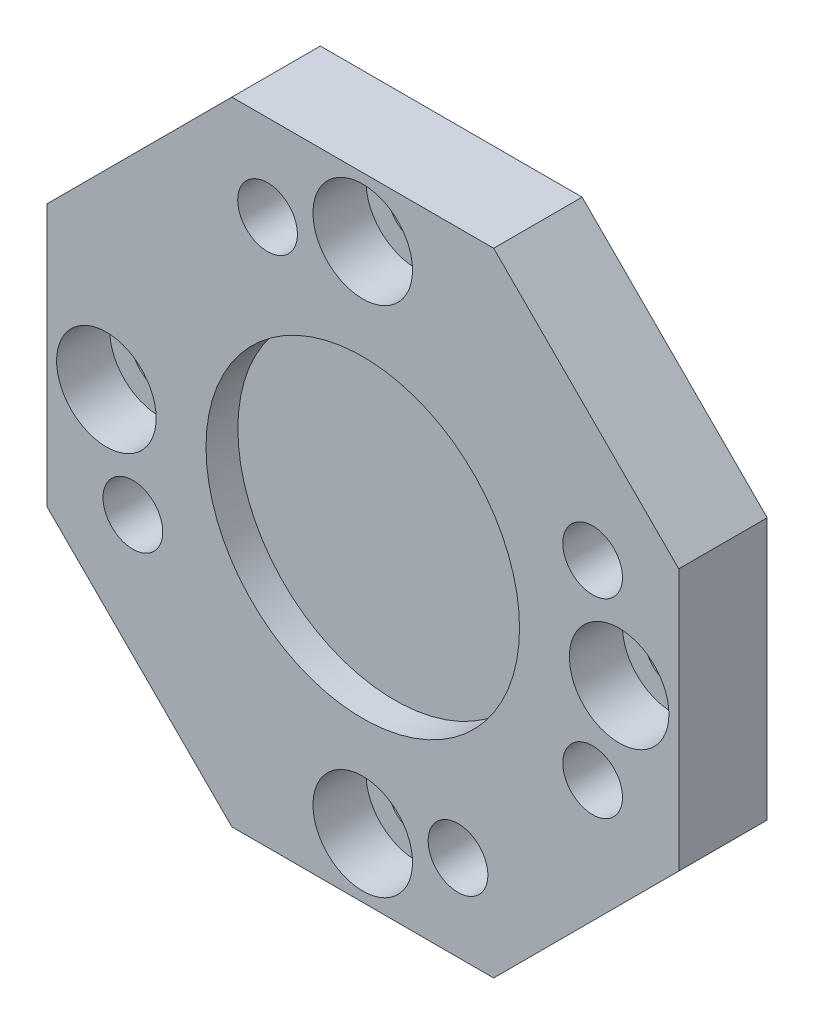
ISO-10303-21;
HEADER;
FILE_DESCRIPTION(('STEP AP214'),'2;1');
FILE_NAME('part.step','',(''),(''),'','','');
FILE_SCHEMA(('AUTOMOTIVE_DESIGN { 1 0 10303 214 1 1 1 1 }'));
ENDSEC;
DATA;
#1=APPLICATION_CONTEXT('core data for automotive mechanical design processes');
#2=APPLICATION_PROTOCOL_DEFINITION('international standard','automotive_design',2000,#1);
#3=PRODUCT_CONTEXT('',#1,'mechanical');
#4=PRODUCT('Part','Part','',(#3));
#5=PRODUCT_RELATED_PRODUCT_CATEGORY('part','',(#4));
#6=PRODUCT_DEFINITION_FORMATION('','',#4);
#7=PRODUCT_DEFINITION_CONTEXT('part definition',#1,'design');
#8=PRODUCT_DEFINITION('design','',#6,#7);
#9=PRODUCT_DEFINITION_SHAPE('','',#8);
#10=(LENGTH_UNIT() NAMED_UNIT(*) SI_UNIT(.MILLI.,.METRE.));
#11=(NAMED_UNIT(*) PLANE_ANGLE_UNIT() SI_UNIT($,.RADIAN.));
#12=(NAMED_UNIT(*) SI_UNIT($,.STERADIAN.) SOLID_ANGLE_UNIT());
#13=UNCERTAINTY_MEASURE_WITH_UNIT(LENGTH_MEASURE(1.E-05),#10,'distance_accuracy_value','');
#14=(GEOMETRIC_REPRESENTATION_CONTEXT(3) GLOBAL_UNCERTAINTY_ASSIGNED_CONTEXT((#13)) GLOBAL_UNIT_ASSIGNED_CONTEXT((#10,
#11,#12)) REPRESENTATION_CONTEXT('',''));
#15=CARTESIAN_POINT('',(0.,0.,0.));
#16=DIRECTION('',(0.,0.,1.));
#17=DIRECTION('',(1.,0.,0.));
#18=AXIS2_PLACEMENT_3D('',#15,#16,#17);
#19=CARTESIAN_POINT('',(0.,0.,0.));
#20=DIRECTION('',(0.,0.,1.));
#21=DIRECTION('',(1.,0.,0.));
#22=AXIS2_PLACEMENT_3D('',#19,#20,#21);
#23=PLANE('',#22);
#24=CARTESIAN_POINT('',(23.0969883127822,9.56708580912723,0.));
#25=DIRECTION('',(0.,0.,-1.));
#26=DIRECTION('',(-1.,0.,0.));
#27=AXIS2_PLACEMENT_3D('',#24,#25,#26);
#28=CIRCLE('',#27,2.99999999999999);
#29=CARTESIAN_POINT('',(20.0969883127822,9.56708580912723,0.));
#30=VERTEX_POINT('',#29);
#31=EDGE_CURVE('E297',#30,#30,#28,.T.);
#32=ORIENTED_EDGE('',*,*,#31,.F.);
#33=EDGE_LOOP('',(#32));
#34=FACE_BOUND('',#33,.T.);
#35=CARTESIAN_POINT('',(9.56708580912724,-23.0969883127822,0.));
#36=DIRECTION('',(0.,0.,-1.));
#37=DIRECTION('',(-1.,0.,0.));
#38=AXIS2_PLACEMENT_3D('',#35,#36,#37);
#39=CIRCLE('',#38,2.99999999999999);
#40=CARTESIAN_POINT('',(6.56708580912725,-23.0969883127822,0.));
#41=VERTEX_POINT('',#40);
#42=EDGE_CURVE('E291',#41,#41,#39,.T.);
#43=ORIENTED_EDGE('',*,*,#42,.F.);
#44=EDGE_LOOP('',(#43));
#45=FACE_BOUND('',#44,.T.);
#46=CARTESIAN_POINT('',(-9.56708580912724,23.0969883127822,0.));
#47=DIRECTION('',(0.,0.,-1.));
#48=DIRECTION('',(-1.,0.,0.));
#49=AXIS2_PLACEMENT_3D('',#46,#47,#48);
#50=CIRCLE('',#49,2.99999999999999);
#51=CARTESIAN_POINT('',(-12.5670858091272,23.0969883127822,0.));
#52=VERTEX_POINT('',#51);
#53=EDGE_CURVE('E279',#52,#52,#50,.T.);
#54=ORIENTED_EDGE('',*,*,#53,.F.);
#55=EDGE_LOOP('',(#54));
#56=FACE_BOUND('',#55,.T.);
#57=CARTESIAN_POINT('',(23.0969883127822,-9.56708580912725,0.));
#58=DIRECTION('',(0.,0.,1.));
#59=DIRECTION('',(1.,0.,0.));
#60=AXIS2_PLACEMENT_3D('',#57,#58,#59);
#61=CIRCLE('',#60,3.);
#62=CARTESIAN_POINT('',(26.0969883127822,-9.56708580912725,0.));
#63=VERTEX_POINT('',#62);
#64=EDGE_CURVE('E273',#63,#63,#61,.T.);
#65=ORIENTED_EDGE('',*,*,#64,.T.);
#66=EDGE_LOOP('',(#65));
#67=FACE_BOUND('',#66,.T.);
#68=CARTESIAN_POINT('',(0.,25.76,0.));
#69=DIRECTION('',(0.,0.,1.));
#70=DIRECTION('',(1.,0.,0.));
#71=AXIS2_PLACEMENT_3D('',#68,#69,#70);
#72=CIRCLE('',#71,2.75);
#73=CARTESIAN_POINT('',(2.74999999999999,25.76,0.));
#74=VERTEX_POINT('',#73);
#75=EDGE_CURVE('E261',#74,#74,#72,.T.);
#76=ORIENTED_EDGE('',*,*,#75,.T.);
#77=EDGE_LOOP('',(#76));
#78=FACE_BOUND('',#77,.T.);
#79=CARTESIAN_POINT('',(25.76,0.,0.));
#80=DIRECTION('',(0.,0.,1.));
#81=DIRECTION('',(1.,0.,0.));
#82=AXIS2_PLACEMENT_3D('',#79,#80,#81);
#83=CIRCLE('',#82,2.75);
#84=CARTESIAN_POINT('',(28.51,0.,0.));
#85=VERTEX_POINT('',#84);
#86=EDGE_CURVE('E249',#85,#85,#83,.T.);
#87=ORIENTED_EDGE('',*,*,#86,.T.);
#88=EDGE_LOOP('',(#87));
#89=FACE_BOUND('',#88,.T.);
#90=CARTESIAN_POINT('',(0.,-25.76,0.));
#91=DIRECTION('',(0.,0.,1.));
#92=DIRECTION('',(1.,0.,0.));
#93=AXIS2_PLACEMENT_3D('',#90,#91,#92);
#94=CIRCLE('',#93,2.75);
#95=CARTESIAN_POINT('',(2.75000000000001,-25.76,0.));
#96=VERTEX_POINT('',#95);
#97=EDGE_CURVE('E237',#96,#96,#94,.T.);
#98=ORIENTED_EDGE('',*,*,#97,.T.);
#99=EDGE_LOOP('',(#98));
#100=FACE_BOUND('',#99,.T.);
#101=CARTESIAN_POINT('',(-25.76,0.,0.));
#102=DIRECTION('',(0.,0.,1.));
#103=DIRECTION('',(1.,0.,0.));
#104=AXIS2_PLACEMENT_3D('',#101,#102,#103);
#105=CIRCLE('',#104,2.75);
#106=CARTESIAN_POINT('',(-23.01,0.,0.));
#107=VERTEX_POINT('',#106);
#108=EDGE_CURVE('E225',#107,#107,#105,.T.);
#109=ORIENTED_EDGE('',*,*,#108,.T.);
#110=EDGE_LOOP('',(#109));
#111=FACE_BOUND('',#110,.T.);
#112=CARTESIAN_POINT('',(0.,0.,0.));
#113=DIRECTION('',(0.,0.,1.));
#114=DIRECTION('',(1.,0.,0.));
#115=AXIS2_PLACEMENT_3D('',#112,#113,#114);
#116=CIRCLE('',#115,21.805);
#117=CARTESIAN_POINT('',(21.805,0.,0.));
#118=VERTEX_POINT('',#117);
#119=EDGE_CURVE('E211',#118,#118,#116,.T.);
#120=ORIENTED_EDGE('',*,*,#119,.T.);
#121=EDGE_LOOP('',(#120));
#122=FACE_BOUND('',#121,.T.);
#123=DIRECTION('',(-0.707106781186548,0.707106781186547,0.));
#124=VECTOR('',#123,1.);
#125=CARTESIAN_POINT('',(22.4506403026729,22.4506403026729,0.));
#126=LINE('',#125,#124);
#127=CARTESIAN_POINT('',(31.7500000000001,13.1512806053458,0.));
#128=VERTEX_POINT('',#127);
#129=CARTESIAN_POINT('',(13.1512806053458,31.75,0.));
#130=VERTEX_POINT('',#129);
#131=EDGE_CURVE('E163',#128,#130,#126,.T.);
#132=ORIENTED_EDGE('',*,*,#131,.F.);
#133=DIRECTION('',(0.,1.,0.));
#134=VECTOR('',#133,1.);
#135=CARTESIAN_POINT('',(31.7500000000001,0.,0.));
#136=LINE('',#135,#134);
#137=CARTESIAN_POINT('',(31.7500000000001,-13.1512806053458,0.));
#138=VERTEX_POINT('',#137);
#139=EDGE_CURVE('E117',#138,#128,#136,.T.);
#140=ORIENTED_EDGE('',*,*,#139,.F.);
#141=DIRECTION('',(0.707106781186547,0.707106781186548,0.));
#142=VECTOR('',#141,1.);
#143=CARTESIAN_POINT('',(22.4506403026729,-22.4506403026729,0.));
#144=LINE('',#143,#142);
#145=CARTESIAN_POINT('',(13.1512806053458,-31.75,0.));
#146=VERTEX_POINT('',#145);
#147=EDGE_CURVE('E111',#146,#138,#144,.T.);
#148=ORIENTED_EDGE('',*,*,#147,.F.);
#149=DIRECTION('',(1.,0.,0.));
#150=VECTOR('',#149,1.);
#151=CARTESIAN_POINT('',(0.,-31.75,0.));
#152=LINE('',#151,#150);
#153=CARTESIAN_POINT('',(-13.1512806053457,-31.75,0.));
#154=VERTEX_POINT('',#153);
#155=EDGE_CURVE('E153',#154,#146,#152,.T.);
#156=ORIENTED_EDGE('',*,*,#155,.F.);
#157=DIRECTION('',(0.707106781186548,-0.707106781186547,0.));
#158=VECTOR('',#157,1.);
#159=CARTESIAN_POINT('',(-22.4506403026728,-22.4506403026729,0.));
#160=LINE('',#159,#158);
#161=CARTESIAN_POINT('',(-31.7499999999999,-13.1512806053458,0.));
#162=VERTEX_POINT('',#161);
#163=EDGE_CURVE('E173',#162,#154,#160,.T.);
#164=ORIENTED_EDGE('',*,*,#163,.F.);
#165=DIRECTION('',(0.,-1.,0.));
#166=VECTOR('',#165,1.);
#167=CARTESIAN_POINT('',(-31.7499999999999,0.,0.));
#168=LINE('',#167,#166);
#169=CARTESIAN_POINT('',(-31.7499999999999,13.1512806053458,0.));
#170=VERTEX_POINT('',#169);
#171=EDGE_CURVE('E171',#170,#162,#168,.T.);
#172=ORIENTED_EDGE('',*,*,#171,.F.);
#173=DIRECTION('',(-0.707106781186547,-0.707106781186548,0.));
#174=VECTOR('',#173,1.);
#175=CARTESIAN_POINT('',(-22.4506403026729,22.4506403026728,0.));
#176=LINE('',#175,#174);
#177=CARTESIAN_POINT('',(-13.1512806053457,31.75,0.));
#178=VERTEX_POINT('',#177);
#179=EDGE_CURVE('E169',#178,#170,#176,.T.);
#180=ORIENTED_EDGE('',*,*,#179,.F.);
#181=DIRECTION('',(-1.,0.,0.));
#182=VECTOR('',#181,1.);
#183=CARTESIAN_POINT('',(0.,31.75,0.));
#184=LINE('',#183,#182);
#185=EDGE_CURVE('E166',#130,#178,#184,.T.);
#186=ORIENTED_EDGE('',*,*,#185,.F.);
#187=EDGE_LOOP('',(#132,#140,#148,#156,#164,#172,#180,#186));
#188=FACE_BOUND('',#187,.T.);
#189=CARTESIAN_POINT('',(-23.0969883127822,-9.56708580912724,0.));
#190=DIRECTION('',(0.,0.,-1.));
#191=DIRECTION('',(-1.,0.,0.));
#192=AXIS2_PLACEMENT_3D('',#189,#190,#191);
#193=CIRCLE('',#192,2.99999999999999);
#194=CARTESIAN_POINT('',(-26.0969883127822,-9.56708580912724,0.));
#195=VERTEX_POINT('',#194);
#196=EDGE_CURVE('E285',#195,#195,#193,.T.);
#197=ORIENTED_EDGE('',*,*,#196,.F.);
#198=EDGE_LOOP('',(#197));
#199=FACE_BOUND('',#198,.T.);
#200=ADVANCED_FACE('F65',(#34,#45,#56,#67,#78,#89,#100,#111,#122,#188,#199),#23,.F.);
#201=CARTESIAN_POINT('',(0.,0.,8.89));
#202=DIRECTION('',(0.,0.,1.));
#203=DIRECTION('',(1.,0.,0.));
#204=AXIS2_PLACEMENT_3D('',#201,#202,#203);
#205=PLANE('',#204);
#206=CARTESIAN_POINT('',(23.0969883127822,9.56708580912723,8.89));
#207=DIRECTION('',(0.,0.,-1.));
#208=DIRECTION('',(-1.,0.,0.));
#209=AXIS2_PLACEMENT_3D('',#206,#207,#208);
#210=CIRCLE('',#209,3.);
#211=CARTESIAN_POINT('',(20.0969883127822,9.56708580912723,8.89));
#212=VERTEX_POINT('',#211);
#213=EDGE_CURVE('E294',#212,#212,#210,.T.);
#214=ORIENTED_EDGE('',*,*,#213,.T.);
#215=EDGE_LOOP('',(#214));
#216=FACE_BOUND('',#215,.T.);
#217=CARTESIAN_POINT('',(9.56708580912724,-23.0969883127822,8.89));
#218=DIRECTION('',(0.,0.,-1.));
#219=DIRECTION('',(-1.,0.,0.));
#220=AXIS2_PLACEMENT_3D('',#217,#218,#219);
#221=CIRCLE('',#220,3.);
#222=CARTESIAN_POINT('',(6.56708580912724,-23.0969883127822,8.89));
#223=VERTEX_POINT('',#222);
#224=EDGE_CURVE('E288',#223,#223,#221,.T.);
#225=ORIENTED_EDGE('',*,*,#224,.T.);
#226=EDGE_LOOP('',(#225));
#227=FACE_BOUND('',#226,.T.);
#228=DIRECTION('',(-0.707106781186548,0.707106781186547,0.));
#229=VECTOR('',#228,1.);
#230=CARTESIAN_POINT('',(22.4506403026729,22.4506403026729,8.89));
#231=LINE('',#230,#229);
#232=CARTESIAN_POINT('',(31.7500000000001,13.1512806053458,8.89));
#233=VERTEX_POINT('',#232);
#234=CARTESIAN_POINT('',(13.1512806053458,31.75,8.89));
#235=VERTEX_POINT('',#234);
#236=EDGE_CURVE('E178',#233,#235,#231,.T.);
#237=ORIENTED_EDGE('',*,*,#236,.T.);
#238=DIRECTION('',(-1.,0.,0.));
#239=VECTOR('',#238,1.);
#240=CARTESIAN_POINT('',(0.,31.75,8.89));
#241=LINE('',#240,#239);
#242=CARTESIAN_POINT('',(-13.1512806053457,31.75,8.89));
#243=VERTEX_POINT('',#242);
#244=EDGE_CURVE('E125',#235,#243,#241,.T.);
#245=ORIENTED_EDGE('',*,*,#244,.T.);
#246=DIRECTION('',(-0.707106781186547,-0.707106781186548,0.));
#247=VECTOR('',#246,1.);
#248=CARTESIAN_POINT('',(-22.4506403026729,22.4506403026728,8.89));
#249=LINE('',#248,#247);
#250=CARTESIAN_POINT('',(-31.7499999999999,13.1512806053458,8.89));
#251=VERTEX_POINT('',#250);
#252=EDGE_CURVE('E193',#243,#251,#249,.T.);
#253=ORIENTED_EDGE('',*,*,#252,.T.);
#254=DIRECTION('',(0.,-1.,0.));
#255=VECTOR('',#254,1.);
#256=CARTESIAN_POINT('',(-31.7499999999999,0.,8.89));
#257=LINE('',#256,#255);
#258=CARTESIAN_POINT('',(-31.7499999999999,-13.1512806053458,8.89));
#259=VERTEX_POINT('',#258);
#260=EDGE_CURVE('E205',#251,#259,#257,.T.);
#261=ORIENTED_EDGE('',*,*,#260,.T.);
#262=DIRECTION('',(0.707106781186548,-0.707106781186547,0.));
#263=VECTOR('',#262,1.);
#264=CARTESIAN_POINT('',(-22.4506403026728,-22.4506403026729,8.89));
#265=LINE('',#264,#263);
#266=CARTESIAN_POINT('',(-13.1512806053457,-31.75,8.89));
#267=VERTEX_POINT('',#266);
#268=EDGE_CURVE('E145',#259,#267,#265,.T.);
#269=ORIENTED_EDGE('',*,*,#268,.T.);
#270=DIRECTION('',(1.,0.,0.));
#271=VECTOR('',#270,1.);
#272=CARTESIAN_POINT('',(0.,-31.75,8.89));
#273=LINE('',#272,#271);
#274=CARTESIAN_POINT('',(13.1512806053458,-31.75,8.89));
#275=VERTEX_POINT('',#274);
#276=EDGE_CURVE('E138',#267,#275,#273,.T.);
#277=ORIENTED_EDGE('',*,*,#276,.T.);
#278=DIRECTION('',(0.707106781186547,0.707106781186548,0.));
#279=VECTOR('',#278,1.);
#280=CARTESIAN_POINT('',(22.4506403026729,-22.4506403026729,8.89));
#281=LINE('',#280,#279);
#282=CARTESIAN_POINT('',(31.7500000000001,-13.1512806053458,8.89));
#283=VERTEX_POINT('',#282);
#284=EDGE_CURVE('E143',#275,#283,#281,.T.);
#285=ORIENTED_EDGE('',*,*,#284,.T.);
#286=DIRECTION('',(0.,1.,0.));
#287=VECTOR('',#286,1.);
#288=CARTESIAN_POINT('',(31.7500000000001,0.,8.89));
#289=LINE('',#288,#287);
#290=EDGE_CURVE('E82',#283,#233,#289,.T.);
#291=ORIENTED_EDGE('',*,*,#290,.T.);
#292=EDGE_LOOP('',(#237,#245,#253,#261,#269,#277,#285,#291));
#293=FACE_BOUND('',#292,.T.);
#294=CARTESIAN_POINT('',(-25.76,0.,8.89));
#295=DIRECTION('',(0.,0.,1.));
#296=DIRECTION('',(1.,0.,0.));
#297=AXIS2_PLACEMENT_3D('',#294,#295,#296);
#298=CIRCLE('',#297,5.);
#299=CARTESIAN_POINT('',(-20.76,0.,8.89));
#300=VERTEX_POINT('',#299);
#301=EDGE_CURVE('E214',#300,#300,#298,.T.);
#302=ORIENTED_EDGE('',*,*,#301,.F.);
#303=EDGE_LOOP('',(#302));
#304=FACE_BOUND('',#303,.T.);
#305=CARTESIAN_POINT('',(0.,-25.76,8.89));
#306=DIRECTION('',(0.,0.,1.));
#307=DIRECTION('',(1.,0.,0.));
#308=AXIS2_PLACEMENT_3D('',#305,#306,#307);
#309=CIRCLE('',#308,5.);
#310=CARTESIAN_POINT('',(5.00000000000001,-25.76,8.89));
#311=VERTEX_POINT('',#310);
#312=EDGE_CURVE('E228',#311,#311,#309,.T.);
#313=ORIENTED_EDGE('',*,*,#312,.F.);
#314=EDGE_LOOP('',(#313));
#315=FACE_BOUND('',#314,.T.);
#316=CARTESIAN_POINT('',(25.76,0.,8.89));
#317=DIRECTION('',(0.,0.,1.));
#318=DIRECTION('',(1.,0.,0.));
#319=AXIS2_PLACEMENT_3D('',#316,#317,#318);
#320=CIRCLE('',#319,5.);
#321=CARTESIAN_POINT('',(30.76,0.,8.89));
#322=VERTEX_POINT('',#321);
#323=EDGE_CURVE('E240',#322,#322,#320,.T.);
#324=ORIENTED_EDGE('',*,*,#323,.F.);
#325=EDGE_LOOP('',(#324));
#326=FACE_BOUND('',#325,.T.);
#327=CARTESIAN_POINT('',(0.,25.76,8.89));
#328=DIRECTION('',(0.,0.,1.));
#329=DIRECTION('',(1.,0.,0.));
#330=AXIS2_PLACEMENT_3D('',#327,#328,#329);
#331=CIRCLE('',#330,5.);
#332=CARTESIAN_POINT('',(4.99999999999999,25.76,8.89));
#333=VERTEX_POINT('',#332);
#334=EDGE_CURVE('E252',#333,#333,#331,.T.);
#335=ORIENTED_EDGE('',*,*,#334,.F.);
#336=EDGE_LOOP('',(#335));
#337=FACE_BOUND('',#336,.T.);
#338=CARTESIAN_POINT('',(0.,0.,8.89));
#339=DIRECTION('',(0.,0.,1.));
#340=DIRECTION('',(1.,0.,0.));
#341=AXIS2_PLACEMENT_3D('',#338,#339,#340);
#342=CIRCLE('',#341,15.75);
#343=CARTESIAN_POINT('',(15.75,0.,8.89));
#344=VERTEX_POINT('',#343);
#345=EDGE_CURVE('E265',#344,#344,#342,.T.);
#346=ORIENTED_EDGE('',*,*,#345,.F.);
#347=EDGE_LOOP('',(#346));
#348=FACE_BOUND('',#347,.T.);
#349=CARTESIAN_POINT('',(23.0969883127822,-9.56708580912725,8.89));
#350=DIRECTION('',(0.,0.,1.));
#351=DIRECTION('',(1.,0.,0.));
#352=AXIS2_PLACEMENT_3D('',#349,#350,#351);
#353=CIRCLE('',#352,3.);
#354=CARTESIAN_POINT('',(26.0969883127822,-9.56708580912725,8.89));
#355=VERTEX_POINT('',#354);
#356=EDGE_CURVE('E268',#355,#355,#353,.T.);
#357=ORIENTED_EDGE('',*,*,#356,.F.);
#358=EDGE_LOOP('',(#357));
#359=FACE_BOUND('',#358,.T.);
#360=CARTESIAN_POINT('',(-9.56708580912724,23.0969883127822,8.89));
#361=DIRECTION('',(0.,0.,-1.));
#362=DIRECTION('',(-1.,0.,0.));
#363=AXIS2_PLACEMENT_3D('',#360,#361,#362);
#364=CIRCLE('',#363,3.);
#365=CARTESIAN_POINT('',(-12.5670858091272,23.0969883127822,8.89));
#366=VERTEX_POINT('',#365);
#367=EDGE_CURVE('E276',#366,#366,#364,.T.);
#368=ORIENTED_EDGE('',*,*,#367,.T.);
#369=EDGE_LOOP('',(#368));
#370=FACE_BOUND('',#369,.T.);
#371=CARTESIAN_POINT('',(-23.0969883127822,-9.56708580912724,8.89));
#372=DIRECTION('',(0.,0.,-1.));
#373=DIRECTION('',(-1.,0.,0.));
#374=AXIS2_PLACEMENT_3D('',#371,#372,#373);
#375=CIRCLE('',#374,3.);
#376=CARTESIAN_POINT('',(-26.0969883127822,-9.56708580912724,8.89));
#377=VERTEX_POINT('',#376);
#378=EDGE_CURVE('E282',#377,#377,#375,.T.);
#379=ORIENTED_EDGE('',*,*,#378,.T.);
#380=EDGE_LOOP('',(#379));
#381=FACE_BOUND('',#380,.T.);
#382=ADVANCED_FACE('F140',(#216,#227,#293,#304,#315,#326,#337,#348,#359,#370,#381),#205,.T.);
#383=CARTESIAN_POINT('',(0.,31.75,8.89));
#384=DIRECTION('',(0.,-1.,0.));
#385=DIRECTION('',(0.,0.,-1.));
#386=AXIS2_PLACEMENT_3D('',#383,#384,#385);
#387=PLANE('',#386);
#388=ORIENTED_EDGE('',*,*,#185,.T.);
#389=DIRECTION('',(0.,0.,-1.));
#390=VECTOR('',#389,1.);
#391=CARTESIAN_POINT('',(-13.1512806053457,31.75,8.89));
#392=LINE('',#391,#390);
#393=EDGE_CURVE('E74',#243,#178,#392,.T.);
#394=ORIENTED_EDGE('',*,*,#393,.F.);
#395=ORIENTED_EDGE('',*,*,#244,.F.);
#396=DIRECTION('',(0.,0.,-1.));
#397=VECTOR('',#396,1.);
#398=CARTESIAN_POINT('',(13.1512806053458,31.75,8.89));
#399=LINE('',#398,#397);
#400=EDGE_CURVE('E12',#235,#130,#399,.T.);
#401=ORIENTED_EDGE('',*,*,#400,.T.);
#402=EDGE_LOOP('',(#388,#394,#395,#401));
#403=FACE_BOUND('',#402,.T.);
#404=ADVANCED_FACE('F339',(#403),#387,.F.);
#405=CARTESIAN_POINT('',(-22.4506403026729,22.4506403026728,8.89));
#406=DIRECTION('',(0.707106781186548,-0.707106781186547,0.));
#407=DIRECTION('',(0.707106781186547,0.707106781186548,0.));
#408=AXIS2_PLACEMENT_3D('',#405,#406,#407);
#409=PLANE('',#408);
#410=ORIENTED_EDGE('',*,*,#179,.T.);
#411=DIRECTION('',(0.,0.,-1.));
#412=VECTOR('',#411,1.);
#413=CARTESIAN_POINT('',(-31.7499999999999,13.1512806053458,8.89));
#414=LINE('',#413,#412);
#415=EDGE_CURVE('E185',#251,#170,#414,.T.);
#416=ORIENTED_EDGE('',*,*,#415,.F.);
#417=ORIENTED_EDGE('',*,*,#252,.F.);
#418=ORIENTED_EDGE('',*,*,#393,.T.);
#419=EDGE_LOOP('',(#410,#416,#417,#418));
#420=FACE_BOUND('',#419,.T.);
#421=ADVANCED_FACE('F191',(#420),#409,.F.);
#422=CARTESIAN_POINT('',(-31.7499999999999,0.,8.89));
#423=DIRECTION('',(1.,0.,0.));
#424=DIRECTION('',(0.,0.,-1.));
#425=AXIS2_PLACEMENT_3D('',#422,#423,#424);
#426=PLANE('',#425);
#427=ORIENTED_EDGE('',*,*,#171,.T.);
#428=DIRECTION('',(0.,0.,-1.));
#429=VECTOR('',#428,1.);
#430=CARTESIAN_POINT('',(-31.7499999999999,-13.1512806053458,8.89));
#431=LINE('',#430,#429);
#432=EDGE_CURVE('E182',#259,#162,#431,.T.);
#433=ORIENTED_EDGE('',*,*,#432,.F.);
#434=ORIENTED_EDGE('',*,*,#260,.F.);
#435=ORIENTED_EDGE('',*,*,#415,.T.);
#436=EDGE_LOOP('',(#427,#433,#434,#435));
#437=FACE_BOUND('',#436,.T.);
#438=ADVANCED_FACE('F201',(#437),#426,.F.);
#439=CARTESIAN_POINT('',(-22.4506403026728,-22.4506403026729,8.89));
#440=DIRECTION('',(0.707106781186547,0.707106781186548,0.));
#441=DIRECTION('',(-0.707106781186548,0.707106781186547,0.));
#442=AXIS2_PLACEMENT_3D('',#439,#440,#441);
#443=PLANE('',#442);
#444=ORIENTED_EDGE('',*,*,#163,.T.);
#445=DIRECTION('',(0.,0.,-1.));
#446=VECTOR('',#445,1.);
#447=CARTESIAN_POINT('',(-13.1512806053457,-31.75,8.89));
#448=LINE('',#447,#446);
#449=EDGE_CURVE('E154',#267,#154,#448,.T.);
#450=ORIENTED_EDGE('',*,*,#449,.F.);
#451=ORIENTED_EDGE('',*,*,#268,.F.);
#452=ORIENTED_EDGE('',*,*,#432,.T.);
#453=EDGE_LOOP('',(#444,#450,#451,#452));
#454=FACE_BOUND('',#453,.T.);
#455=ADVANCED_FACE('F204',(#454),#443,.F.);
#456=CARTESIAN_POINT('',(0.,-31.75,8.89));
#457=DIRECTION('',(0.,1.,0.));
#458=DIRECTION('',(0.,0.,1.));
#459=AXIS2_PLACEMENT_3D('',#456,#457,#458);
#460=PLANE('',#459);
#461=ORIENTED_EDGE('',*,*,#155,.T.);
#462=DIRECTION('',(0.,0.,-1.));
#463=VECTOR('',#462,1.);
#464=CARTESIAN_POINT('',(13.1512806053458,-31.75,8.89));
#465=LINE('',#464,#463);
#466=EDGE_CURVE('E150',#275,#146,#465,.T.);
#467=ORIENTED_EDGE('',*,*,#466,.F.);
#468=ORIENTED_EDGE('',*,*,#276,.F.);
#469=ORIENTED_EDGE('',*,*,#449,.T.);
#470=EDGE_LOOP('',(#461,#467,#468,#469));
#471=FACE_BOUND('',#470,.T.);
#472=ADVANCED_FACE('F151',(#471),#460,.F.);
#473=CARTESIAN_POINT('',(22.4506403026729,-22.4506403026729,8.89));
#474=DIRECTION('',(-0.707106781186548,0.707106781186547,0.));
#475=DIRECTION('',(-0.707106781186547,-0.707106781186548,0.));
#476=AXIS2_PLACEMENT_3D('',#473,#474,#475);
#477=PLANE('',#476);
#478=ORIENTED_EDGE('',*,*,#147,.T.);
#479=DIRECTION('',(0.,0.,-1.));
#480=VECTOR('',#479,1.);
#481=CARTESIAN_POINT('',(31.7500000000001,-13.1512806053458,8.89));
#482=LINE('',#481,#480);
#483=EDGE_CURVE('E155',#283,#138,#482,.T.);
#484=ORIENTED_EDGE('',*,*,#483,.F.);
#485=ORIENTED_EDGE('',*,*,#284,.F.);
#486=ORIENTED_EDGE('',*,*,#466,.T.);
#487=EDGE_LOOP('',(#478,#484,#485,#486));
#488=FACE_BOUND('',#487,.T.);
#489=ADVANCED_FACE('F157',(#488),#477,.F.);
#490=CARTESIAN_POINT('',(31.7500000000001,0.,8.89));
#491=DIRECTION('',(-1.,0.,0.));
#492=DIRECTION('',(0.,0.,1.));
#493=AXIS2_PLACEMENT_3D('',#490,#491,#492);
#494=PLANE('',#493);
#495=ORIENTED_EDGE('',*,*,#139,.T.);
#496=DIRECTION('',(0.,0.,-1.));
#497=VECTOR('',#496,1.);
#498=CARTESIAN_POINT('',(31.7500000000001,13.1512806053458,8.89));
#499=LINE('',#498,#497);
#500=EDGE_CURVE('E159',#233,#128,#499,.T.);
#501=ORIENTED_EDGE('',*,*,#500,.F.);
#502=ORIENTED_EDGE('',*,*,#290,.F.);
#503=ORIENTED_EDGE('',*,*,#483,.T.);
#504=EDGE_LOOP('',(#495,#501,#502,#503));
#505=FACE_BOUND('',#504,.T.);
#506=ADVANCED_FACE('F334',(#505),#494,.F.);
#507=CARTESIAN_POINT('',(22.4506403026729,22.4506403026729,8.89));
#508=DIRECTION('',(-0.707106781186547,-0.707106781186548,0.));
#509=DIRECTION('',(0.707106781186548,-0.707106781186547,0.));
#510=AXIS2_PLACEMENT_3D('',#507,#508,#509);
#511=PLANE('',#510);
#512=ORIENTED_EDGE('',*,*,#131,.T.);
#513=ORIENTED_EDGE('',*,*,#400,.F.);
#514=ORIENTED_EDGE('',*,*,#236,.F.);
#515=ORIENTED_EDGE('',*,*,#500,.T.);
#516=EDGE_LOOP('',(#512,#513,#514,#515));
#517=FACE_BOUND('',#516,.T.);
#518=ADVANCED_FACE('F67',(#517),#511,.F.);
#519=CARTESIAN_POINT('',(0.,0.,3.2));
#520=DIRECTION('',(0.,0.,-1.));
#521=DIRECTION('',(-1.,0.,0.));
#522=AXIS2_PLACEMENT_3D('',#519,#520,#521);
#523=CYLINDRICAL_SURFACE('',#522,21.805);
#524=CARTESIAN_POINT('',(0.,0.,3.2));
#525=DIRECTION('',(0.,0.,1.));
#526=DIRECTION('',(1.,0.,0.));
#527=AXIS2_PLACEMENT_3D('',#524,#525,#526);
#528=CIRCLE('',#527,21.805);
#529=CARTESIAN_POINT('',(21.805,0.,3.2));
#530=VERTEX_POINT('',#529);
#531=EDGE_CURVE('E167',#530,#530,#528,.T.);
#532=ORIENTED_EDGE('',*,*,#531,.T.);
#533=EDGE_LOOP('',(#532));
#534=FACE_BOUND('',#533,.T.);
#535=ORIENTED_EDGE('',*,*,#119,.F.);
#536=EDGE_LOOP('',(#535));
#537=FACE_BOUND('',#536,.T.);
#538=ADVANCED_FACE('F322',(#534,#537),#523,.F.);
#539=CARTESIAN_POINT('',(0.,0.,3.2));
#540=DIRECTION('',(0.,0.,1.));
#541=DIRECTION('',(1.,0.,0.));
#542=AXIS2_PLACEMENT_3D('',#539,#540,#541);
#543=PLANE('',#542);
#544=ORIENTED_EDGE('',*,*,#531,.F.);
#545=EDGE_LOOP('',(#544));
#546=FACE_BOUND('',#545,.T.);
#547=ADVANCED_FACE('F324',(#546),#543,.F.);
#548=CARTESIAN_POINT('',(-25.76,0.,8.89));
#549=DIRECTION('',(0.,0.,1.));
#550=DIRECTION('',(1.,0.,0.));
#551=AXIS2_PLACEMENT_3D('',#548,#549,#550);
#552=CYLINDRICAL_SURFACE('',#551,5.);
#553=CARTESIAN_POINT('',(-25.76,0.,3.556));
#554=DIRECTION('',(0.,0.,1.));
#555=DIRECTION('',(1.,0.,0.));
#556=AXIS2_PLACEMENT_3D('',#553,#554,#555);
#557=CIRCLE('',#556,5.);
#558=CARTESIAN_POINT('',(-20.76,0.,3.556));
#559=VERTEX_POINT('',#558);
#560=EDGE_CURVE('E219',#559,#559,#557,.T.);
#561=ORIENTED_EDGE('',*,*,#560,.F.);
#562=EDGE_LOOP('',(#561));
#563=FACE_BOUND('',#562,.T.);
#564=ORIENTED_EDGE('',*,*,#301,.T.);
#565=EDGE_LOOP('',(#564));
#566=FACE_BOUND('',#565,.T.);
#567=ADVANCED_FACE('F331',(#563,#566),#552,.F.);
#568=CARTESIAN_POINT('',(-20.76,0.,3.556));
#569=DIRECTION('',(0.,0.,-1.));
#570=DIRECTION('',(-1.,0.,0.));
#571=AXIS2_PLACEMENT_3D('',#568,#569,#570);
#572=PLANE('',#571);
#573=CARTESIAN_POINT('',(-25.76,0.,3.556));
#574=DIRECTION('',(0.,0.,1.));
#575=DIRECTION('',(1.,0.,0.));
#576=AXIS2_PLACEMENT_3D('',#573,#574,#575);
#577=CIRCLE('',#576,2.75);
#578=CARTESIAN_POINT('',(-23.01,0.,3.556));
#579=VERTEX_POINT('',#578);
#580=EDGE_CURVE('E222',#579,#579,#577,.T.);
#581=ORIENTED_EDGE('',*,*,#580,.F.);
#582=EDGE_LOOP('',(#581));
#583=FACE_BOUND('',#582,.T.);
#584=ORIENTED_EDGE('',*,*,#560,.T.);
#585=EDGE_LOOP('',(#584));
#586=FACE_BOUND('',#585,.T.);
#587=ADVANCED_FACE('F407',(#583,#586),#572,.F.);
#588=CARTESIAN_POINT('',(-25.76,0.,8.89));
#589=DIRECTION('',(0.,0.,1.));
#590=DIRECTION('',(1.,0.,0.));
#591=AXIS2_PLACEMENT_3D('',#588,#589,#590);
#592=CYLINDRICAL_SURFACE('',#591,2.75);
#593=ORIENTED_EDGE('',*,*,#108,.F.);
#594=EDGE_LOOP('',(#593));
#595=FACE_BOUND('',#594,.T.);
#596=ORIENTED_EDGE('',*,*,#580,.T.);
#597=EDGE_LOOP('',(#596));
#598=FACE_BOUND('',#597,.T.);
#599=ADVANCED_FACE('F416',(#595,#598),#592,.F.);
#600=CARTESIAN_POINT('',(0.,-25.76,8.89));
#601=DIRECTION('',(0.,0.,1.));
#602=DIRECTION('',(1.,0.,0.));
#603=AXIS2_PLACEMENT_3D('',#600,#601,#602);
#604=CYLINDRICAL_SURFACE('',#603,5.);
#605=CARTESIAN_POINT('',(0.,-25.76,3.556));
#606=DIRECTION('',(0.,0.,1.));
#607=DIRECTION('',(1.,0.,0.));
#608=AXIS2_PLACEMENT_3D('',#605,#606,#607);
#609=CIRCLE('',#608,5.);
#610=CARTESIAN_POINT('',(5.00000000000001,-25.76,3.556));
#611=VERTEX_POINT('',#610);
#612=EDGE_CURVE('E231',#611,#611,#609,.T.);
#613=ORIENTED_EDGE('',*,*,#612,.F.);
#614=EDGE_LOOP('',(#613));
#615=FACE_BOUND('',#614,.T.);
#616=ORIENTED_EDGE('',*,*,#312,.T.);
#617=EDGE_LOOP('',(#616));
#618=FACE_BOUND('',#617,.T.);
#619=ADVANCED_FACE('F426',(#615,#618),#604,.F.);
#620=CARTESIAN_POINT('',(5.00000000000001,-25.76,3.556));
#621=DIRECTION('',(0.,0.,-1.));
#622=DIRECTION('',(-1.,0.,0.));
#623=AXIS2_PLACEMENT_3D('',#620,#621,#622);
#624=PLANE('',#623);
#625=CARTESIAN_POINT('',(0.,-25.76,3.556));
#626=DIRECTION('',(0.,0.,1.));
#627=DIRECTION('',(1.,0.,0.));
#628=AXIS2_PLACEMENT_3D('',#625,#626,#627);
#629=CIRCLE('',#628,2.75);
#630=CARTESIAN_POINT('',(2.75000000000001,-25.76,3.556));
#631=VERTEX_POINT('',#630);
#632=EDGE_CURVE('E234',#631,#631,#629,.T.);
#633=ORIENTED_EDGE('',*,*,#632,.F.);
#634=EDGE_LOOP('',(#633));
#635=FACE_BOUND('',#634,.T.);
#636=ORIENTED_EDGE('',*,*,#612,.T.);
#637=EDGE_LOOP('',(#636));
#638=FACE_BOUND('',#637,.T.);
#639=ADVANCED_FACE('F436',(#635,#638),#624,.F.);
#640=CARTESIAN_POINT('',(0.,-25.76,8.89));
#641=DIRECTION('',(0.,0.,1.));
#642=DIRECTION('',(1.,0.,0.));
#643=AXIS2_PLACEMENT_3D('',#640,#641,#642);
#644=CYLINDRICAL_SURFACE('',#643,2.75);
#645=ORIENTED_EDGE('',*,*,#97,.F.);
#646=EDGE_LOOP('',(#645));
#647=FACE_BOUND('',#646,.T.);
#648=ORIENTED_EDGE('',*,*,#632,.T.);
#649=EDGE_LOOP('',(#648));
#650=FACE_BOUND('',#649,.T.);
#651=ADVANCED_FACE('F446',(#647,#650),#644,.F.);
#652=CARTESIAN_POINT('',(25.76,0.,8.89));
#653=DIRECTION('',(0.,0.,1.));
#654=DIRECTION('',(1.,0.,0.));
#655=AXIS2_PLACEMENT_3D('',#652,#653,#654);
#656=CYLINDRICAL_SURFACE('',#655,5.);
#657=CARTESIAN_POINT('',(25.76,0.,3.556));
#658=DIRECTION('',(0.,0.,1.));
#659=DIRECTION('',(1.,0.,0.));
#660=AXIS2_PLACEMENT_3D('',#657,#658,#659);
#661=CIRCLE('',#660,5.);
#662=CARTESIAN_POINT('',(30.76,0.,3.556));
#663=VERTEX_POINT('',#662);
#664=EDGE_CURVE('E243',#663,#663,#661,.T.);
#665=ORIENTED_EDGE('',*,*,#664,.F.);
#666=EDGE_LOOP('',(#665));
#667=FACE_BOUND('',#666,.T.);
#668=ORIENTED_EDGE('',*,*,#323,.T.);
#669=EDGE_LOOP('',(#668));
#670=FACE_BOUND('',#669,.T.);
#671=ADVANCED_FACE('F456',(#667,#670),#656,.F.);
#672=CARTESIAN_POINT('',(30.76,0.,3.556));
#673=DIRECTION('',(0.,0.,-1.));
#674=DIRECTION('',(-1.,0.,0.));
#675=AXIS2_PLACEMENT_3D('',#672,#673,#674);
#676=PLANE('',#675);
#677=CARTESIAN_POINT('',(25.76,0.,3.556));
#678=DIRECTION('',(0.,0.,1.));
#679=DIRECTION('',(1.,0.,0.));
#680=AXIS2_PLACEMENT_3D('',#677,#678,#679);
#681=CIRCLE('',#680,2.75);
#682=CARTESIAN_POINT('',(28.51,0.,3.556));
#683=VERTEX_POINT('',#682);
#684=EDGE_CURVE('E246',#683,#683,#681,.T.);
#685=ORIENTED_EDGE('',*,*,#684,.F.);
#686=EDGE_LOOP('',(#685));
#687=FACE_BOUND('',#686,.T.);
#688=ORIENTED_EDGE('',*,*,#664,.T.);
#689=EDGE_LOOP('',(#688));
#690=FACE_BOUND('',#689,.T.);
#691=ADVANCED_FACE('F466',(#687,#690),#676,.F.);
#692=CARTESIAN_POINT('',(25.76,0.,8.89));
#693=DIRECTION('',(0.,0.,1.));
#694=DIRECTION('',(1.,0.,0.));
#695=AXIS2_PLACEMENT_3D('',#692,#693,#694);
#696=CYLINDRICAL_SURFACE('',#695,2.75);
#697=ORIENTED_EDGE('',*,*,#86,.F.);
#698=EDGE_LOOP('',(#697));
#699=FACE_BOUND('',#698,.T.);
#700=ORIENTED_EDGE('',*,*,#684,.T.);
#701=EDGE_LOOP('',(#700));
#702=FACE_BOUND('',#701,.T.);
#703=ADVANCED_FACE('F476',(#699,#702),#696,.F.);
#704=CARTESIAN_POINT('',(0.,25.76,8.89));
#705=DIRECTION('',(0.,0.,1.));
#706=DIRECTION('',(1.,0.,0.));
#707=AXIS2_PLACEMENT_3D('',#704,#705,#706);
#708=CYLINDRICAL_SURFACE('',#707,5.);
#709=CARTESIAN_POINT('',(0.,25.76,3.556));
#710=DIRECTION('',(0.,0.,1.));
#711=DIRECTION('',(1.,0.,0.));
#712=AXIS2_PLACEMENT_3D('',#709,#710,#711);
#713=CIRCLE('',#712,5.);
#714=CARTESIAN_POINT('',(4.99999999999999,25.76,3.556));
#715=VERTEX_POINT('',#714);
#716=EDGE_CURVE('E255',#715,#715,#713,.T.);
#717=ORIENTED_EDGE('',*,*,#716,.F.);
#718=EDGE_LOOP('',(#717));
#719=FACE_BOUND('',#718,.T.);
#720=ORIENTED_EDGE('',*,*,#334,.T.);
#721=EDGE_LOOP('',(#720));
#722=FACE_BOUND('',#721,.T.);
#723=ADVANCED_FACE('F486',(#719,#722),#708,.F.);
#724=CARTESIAN_POINT('',(4.99999999999999,25.76,3.556));
#725=DIRECTION('',(0.,0.,-1.));
#726=DIRECTION('',(-1.,0.,0.));
#727=AXIS2_PLACEMENT_3D('',#724,#725,#726);
#728=PLANE('',#727);
#729=CARTESIAN_POINT('',(0.,25.76,3.556));
#730=DIRECTION('',(0.,0.,1.));
#731=DIRECTION('',(1.,0.,0.));
#732=AXIS2_PLACEMENT_3D('',#729,#730,#731);
#733=CIRCLE('',#732,2.75);
#734=CARTESIAN_POINT('',(2.74999999999999,25.76,3.556));
#735=VERTEX_POINT('',#734);
#736=EDGE_CURVE('E258',#735,#735,#733,.T.);
#737=ORIENTED_EDGE('',*,*,#736,.F.);
#738=EDGE_LOOP('',(#737));
#739=FACE_BOUND('',#738,.T.);
#740=ORIENTED_EDGE('',*,*,#716,.T.);
#741=EDGE_LOOP('',(#740));
#742=FACE_BOUND('',#741,.T.);
#743=ADVANCED_FACE('F496',(#739,#742),#728,.F.);
#744=CARTESIAN_POINT('',(0.,25.76,8.89));
#745=DIRECTION('',(0.,0.,1.));
#746=DIRECTION('',(1.,0.,0.));
#747=AXIS2_PLACEMENT_3D('',#744,#745,#746);
#748=CYLINDRICAL_SURFACE('',#747,2.75);
#749=ORIENTED_EDGE('',*,*,#75,.F.);
#750=EDGE_LOOP('',(#749));
#751=FACE_BOUND('',#750,.T.);
#752=ORIENTED_EDGE('',*,*,#736,.T.);
#753=EDGE_LOOP('',(#752));
#754=FACE_BOUND('',#753,.T.);
#755=ADVANCED_FACE('F506',(#751,#754),#748,.F.);
#756=CARTESIAN_POINT('',(0.,0.,5.69));
#757=DIRECTION('',(0.,0.,1.));
#758=DIRECTION('',(1.,0.,0.));
#759=AXIS2_PLACEMENT_3D('',#756,#757,#758);
#760=CYLINDRICAL_SURFACE('',#759,15.75);
#761=CARTESIAN_POINT('',(0.,0.,5.69));
#762=DIRECTION('',(0.,0.,1.));
#763=DIRECTION('',(1.,0.,0.));
#764=AXIS2_PLACEMENT_3D('',#761,#762,#763);
#765=CIRCLE('',#764,15.75);
#766=CARTESIAN_POINT('',(15.75,0.,5.69));
#767=VERTEX_POINT('',#766);
#768=EDGE_CURVE('E264',#767,#767,#765,.T.);
#769=ORIENTED_EDGE('',*,*,#768,.F.);
#770=EDGE_LOOP('',(#769));
#771=FACE_BOUND('',#770,.T.);
#772=ORIENTED_EDGE('',*,*,#345,.T.);
#773=EDGE_LOOP('',(#772));
#774=FACE_BOUND('',#773,.T.);
#775=ADVANCED_FACE('F516',(#771,#774),#760,.F.);
#776=CARTESIAN_POINT('',(0.,0.,5.69));
#777=DIRECTION('',(0.,0.,1.));
#778=DIRECTION('',(1.,0.,0.));
#779=AXIS2_PLACEMENT_3D('',#776,#777,#778);
#780=PLANE('',#779);
#781=ORIENTED_EDGE('',*,*,#768,.T.);
#782=EDGE_LOOP('',(#781));
#783=FACE_BOUND('',#782,.T.);
#784=ADVANCED_FACE('F526',(#783),#780,.T.);
#785=CARTESIAN_POINT('',(23.0969883127822,-9.56708580912725,8.89));
#786=DIRECTION('',(0.,0.,1.));
#787=DIRECTION('',(1.,0.,0.));
#788=AXIS2_PLACEMENT_3D('',#785,#786,#787);
#789=CYLINDRICAL_SURFACE('',#788,3.);
#790=ORIENTED_EDGE('',*,*,#64,.F.);
#791=EDGE_LOOP('',(#790));
#792=FACE_BOUND('',#791,.T.);
#793=ORIENTED_EDGE('',*,*,#356,.T.);
#794=EDGE_LOOP('',(#793));
#795=FACE_BOUND('',#794,.T.);
#796=ADVANCED_FACE('F536',(#792,#795),#789,.F.);
#797=CARTESIAN_POINT('',(-9.56708580912724,23.0969883127822,0.));
#798=DIRECTION('',(0.,0.,-1.));
#799=DIRECTION('',(-1.,0.,0.));
#800=AXIS2_PLACEMENT_3D('',#797,#798,#799);
#801=CYLINDRICAL_SURFACE('',#800,2.99999999999999);
#802=ORIENTED_EDGE('',*,*,#367,.F.);
#803=EDGE_LOOP('',(#802));
#804=FACE_BOUND('',#803,.T.);
#805=ORIENTED_EDGE('',*,*,#53,.T.);
#806=EDGE_LOOP('',(#805));
#807=FACE_BOUND('',#806,.T.);
#808=ADVANCED_FACE('F546',(#804,#807),#801,.F.);
#809=CARTESIAN_POINT('',(-23.0969883127822,-9.56708580912724,0.));
#810=DIRECTION('',(0.,0.,-1.));
#811=DIRECTION('',(-1.,0.,0.));
#812=AXIS2_PLACEMENT_3D('',#809,#810,#811);
#813=CYLINDRICAL_SURFACE('',#812,2.99999999999999);
#814=ORIENTED_EDGE('',*,*,#378,.F.);
#815=EDGE_LOOP('',(#814));
#816=FACE_BOUND('',#815,.T.);
#817=ORIENTED_EDGE('',*,*,#196,.T.);
#818=EDGE_LOOP('',(#817));
#819=FACE_BOUND('',#818,.T.);
#820=ADVANCED_FACE('F566',(#816,#819),#813,.F.);
#821=CARTESIAN_POINT('',(9.56708580912724,-23.0969883127822,0.));
#822=DIRECTION('',(0.,0.,-1.));
#823=DIRECTION('',(-1.,0.,0.));
#824=AXIS2_PLACEMENT_3D('',#821,#822,#823);
#825=CYLINDRICAL_SURFACE('',#824,2.99999999999999);
#826=ORIENTED_EDGE('',*,*,#224,.F.);
#827=EDGE_LOOP('',(#826));
#828=FACE_BOUND('',#827,.T.);
#829=ORIENTED_EDGE('',*,*,#42,.T.);
#830=EDGE_LOOP('',(#829));
#831=FACE_BOUND('',#830,.T.);
#832=ADVANCED_FACE('F576',(#828,#831),#825,.F.);
#833=CARTESIAN_POINT('',(23.0969883127822,9.56708580912723,0.));
#834=DIRECTION('',(0.,0.,-1.));
#835=DIRECTION('',(-1.,0.,0.));
#836=AXIS2_PLACEMENT_3D('',#833,#834,#835);
#837=CYLINDRICAL_SURFACE('',#836,2.99999999999999);
#838=ORIENTED_EDGE('',*,*,#213,.F.);
#839=EDGE_LOOP('',(#838));
#840=FACE_BOUND('',#839,.T.);
#841=ORIENTED_EDGE('',*,*,#31,.T.);
#842=EDGE_LOOP('',(#841));
#843=FACE_BOUND('',#842,.T.);
#844=ADVANCED_FACE('F301',(#840,#843),#837,.F.);
#845=CLOSED_SHELL('',(#200,#382,#404,#421,#438,#455,#472,#489,#506,#518,#538,#547,#567,#587,
#599,#619,#639,#651,#671,#691,#703,#723,#743,#755,#775,#784,#796,#808,#820,#832,#844));
#846=MANIFOLD_SOLID_BREP('B2',#845);
#847=ADVANCED_BREP_SHAPE_REPRESENTATION('',(#18,#846),#14);
#848=SHAPE_DEFINITION_REPRESENTATION(#9,#847);
ENDSEC;
END-ISO-10303-21;
